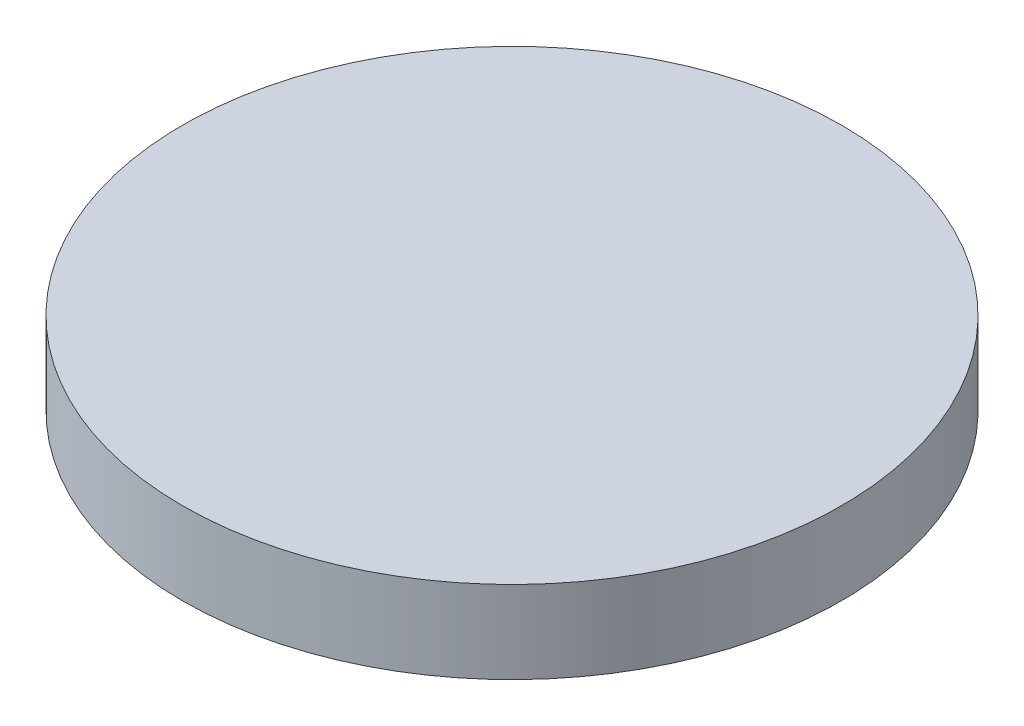
ISO-10303-21;
HEADER;
FILE_DESCRIPTION(('STEP AP214'),'2;1');
FILE_NAME('part.step','',(''),(''),'','','');
FILE_SCHEMA(('AUTOMOTIVE_DESIGN { 1 0 10303 214 1 1 1 1 }'));
ENDSEC;
DATA;
#1=APPLICATION_CONTEXT('core data for automotive mechanical design processes');
#2=APPLICATION_PROTOCOL_DEFINITION('international standard','automotive_design',2000,#1);
#3=PRODUCT_CONTEXT('',#1,'mechanical');
#4=PRODUCT('Part','Part','',(#3));
#5=PRODUCT_RELATED_PRODUCT_CATEGORY('part','',(#4));
#6=PRODUCT_DEFINITION_FORMATION('','',#4);
#7=PRODUCT_DEFINITION_CONTEXT('part definition',#1,'design');
#8=PRODUCT_DEFINITION('design','',#6,#7);
#9=PRODUCT_DEFINITION_SHAPE('','',#8);
#10=(LENGTH_UNIT() NAMED_UNIT(*) SI_UNIT(.MILLI.,.METRE.));
#11=(NAMED_UNIT(*) PLANE_ANGLE_UNIT() SI_UNIT($,.RADIAN.));
#12=(NAMED_UNIT(*) SI_UNIT($,.STERADIAN.) SOLID_ANGLE_UNIT());
#13=UNCERTAINTY_MEASURE_WITH_UNIT(LENGTH_MEASURE(1.E-05),#10,'distance_accuracy_value','');
#14=(GEOMETRIC_REPRESENTATION_CONTEXT(3) GLOBAL_UNCERTAINTY_ASSIGNED_CONTEXT((#13)) GLOBAL_UNIT_ASSIGNED_CONTEXT((#10,
#11,#12)) REPRESENTATION_CONTEXT('',''));
#15=CARTESIAN_POINT('',(0.,0.,0.));
#16=DIRECTION('',(0.,0.,1.));
#17=DIRECTION('',(1.,0.,0.));
#18=AXIS2_PLACEMENT_3D('',#15,#16,#17);
#19=CARTESIAN_POINT('',(0.,1.,0.));
#20=DIRECTION('',(0.,-1.,0.));
#21=DIRECTION('',(0.,0.,-1.));
#22=AXIS2_PLACEMENT_3D('',#19,#20,#21);
#23=CYLINDRICAL_SURFACE('',#22,4.);
#24=CARTESIAN_POINT('',(0.,1.,0.));
#25=DIRECTION('',(0.,1.,0.));
#26=DIRECTION('',(0.,0.,1.));
#27=AXIS2_PLACEMENT_3D('',#24,#25,#26);
#28=CIRCLE('',#27,4.);
#29=CARTESIAN_POINT('',(0.,1.,4.));
#30=VERTEX_POINT('',#29);
#31=EDGE_CURVE('E10',#30,#30,#28,.T.);
#32=ORIENTED_EDGE('',*,*,#31,.F.);
#33=EDGE_LOOP('',(#32));
#34=FACE_BOUND('',#33,.T.);
#35=CARTESIAN_POINT('',(0.,0.,0.));
#36=DIRECTION('',(0.,1.,0.));
#37=DIRECTION('',(0.,0.,1.));
#38=AXIS2_PLACEMENT_3D('',#35,#36,#37);
#39=CIRCLE('',#38,4.);
#40=CARTESIAN_POINT('',(0.,0.,4.));
#41=VERTEX_POINT('',#40);
#42=EDGE_CURVE('E34',#41,#41,#39,.T.);
#43=ORIENTED_EDGE('',*,*,#42,.T.);
#44=EDGE_LOOP('',(#43));
#45=FACE_BOUND('',#44,.T.);
#46=ADVANCED_FACE('F31',(#34,#45),#23,.T.);
#47=CARTESIAN_POINT('',(0.,1.,0.));
#48=DIRECTION('',(0.,1.,0.));
#49=DIRECTION('',(0.,0.,1.));
#50=AXIS2_PLACEMENT_3D('',#47,#48,#49);
#51=PLANE('',#50);
#52=ORIENTED_EDGE('',*,*,#31,.T.);
#53=EDGE_LOOP('',(#52));
#54=FACE_BOUND('',#53,.T.);
#55=ADVANCED_FACE('F46',(#54),#51,.T.);
#56=CARTESIAN_POINT('',(0.,0.,0.));
#57=DIRECTION('',(0.,1.,0.));
#58=DIRECTION('',(0.,0.,1.));
#59=AXIS2_PLACEMENT_3D('',#56,#57,#58);
#60=PLANE('',#59);
#61=ORIENTED_EDGE('',*,*,#42,.F.);
#62=EDGE_LOOP('',(#61));
#63=FACE_BOUND('',#62,.T.);
#64=ADVANCED_FACE('F44',(#63),#60,.F.);
#65=CLOSED_SHELL('',(#46,#55,#64));
#66=MANIFOLD_SOLID_BREP('B2',#65);
#67=ADVANCED_BREP_SHAPE_REPRESENTATION('',(#18,#66),#14);
#68=SHAPE_DEFINITION_REPRESENTATION(#9,#67);
ENDSEC;
END-ISO-10303-21;
